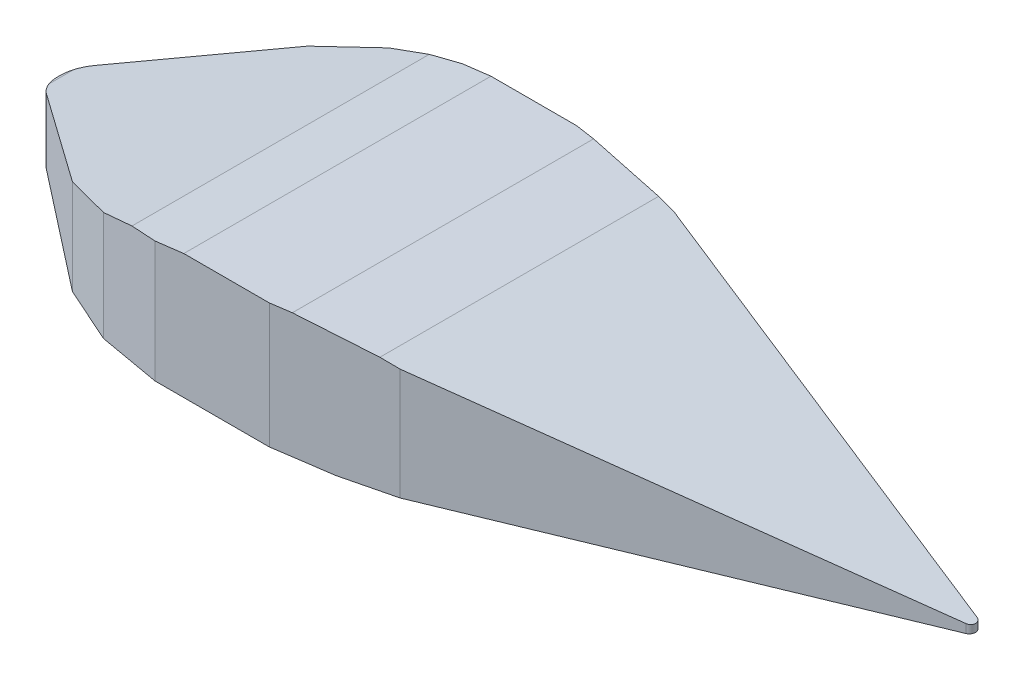
ISO-10303-21;
HEADER;
FILE_DESCRIPTION(('STEP AP214'),'2;1');
FILE_NAME('part.step','',(''),(''),'','','');
FILE_SCHEMA(('AUTOMOTIVE_DESIGN { 1 0 10303 214 1 1 1 1 }'));
ENDSEC;
DATA;
#1=APPLICATION_CONTEXT('core data for automotive mechanical design processes');
#2=APPLICATION_PROTOCOL_DEFINITION('international standard','automotive_design',2000,#1);
#3=PRODUCT_CONTEXT('',#1,'mechanical');
#4=PRODUCT('Part','Part','',(#3));
#5=PRODUCT_RELATED_PRODUCT_CATEGORY('part','',(#4));
#6=PRODUCT_DEFINITION_FORMATION('','',#4);
#7=PRODUCT_DEFINITION_CONTEXT('part definition',#1,'design');
#8=PRODUCT_DEFINITION('design','',#6,#7);
#9=PRODUCT_DEFINITION_SHAPE('','',#8);
#10=(LENGTH_UNIT() NAMED_UNIT(*) SI_UNIT(.MILLI.,.METRE.));
#11=(NAMED_UNIT(*) PLANE_ANGLE_UNIT() SI_UNIT($,.RADIAN.));
#12=(NAMED_UNIT(*) SI_UNIT($,.STERADIAN.) SOLID_ANGLE_UNIT());
#13=UNCERTAINTY_MEASURE_WITH_UNIT(LENGTH_MEASURE(1.E-05),#10,'distance_accuracy_value','');
#14=(GEOMETRIC_REPRESENTATION_CONTEXT(3) GLOBAL_UNCERTAINTY_ASSIGNED_CONTEXT((#13)) GLOBAL_UNIT_ASSIGNED_CONTEXT((#10,
#11,#12)) REPRESENTATION_CONTEXT('',''));
#15=CARTESIAN_POINT('',(0.,0.,0.));
#16=DIRECTION('',(0.,0.,1.));
#17=DIRECTION('',(1.,0.,0.));
#18=AXIS2_PLACEMENT_3D('',#15,#16,#17);
#19=CARTESIAN_POINT('',(1401.451,800.,-800.));
#20=DIRECTION('',(0.,0.,1.));
#21=DIRECTION('',(1.,0.,0.));
#22=AXIS2_PLACEMENT_3D('',#19,#20,#21);
#23=PLANE('',#22);
#24=DIRECTION('',(-0.992522376322293,-0.122062821938327,0.));
#25=VECTOR('',#24,1.);
#26=CARTESIAN_POINT('',(1255.921,763.655,-800.));
#27=LINE('',#26,#25);
#28=CARTESIAN_POINT('',(1551.451,800.,-800.));
#29=VERTEX_POINT('',#28);
#30=CARTESIAN_POINT('',(1401.451,781.55263425033,-800.));
#31=VERTEX_POINT('',#30);
#32=EDGE_CURVE('E469',#29,#31,#27,.T.);
#33=ORIENTED_EDGE('',*,*,#32,.F.);
#34=DIRECTION('',(-1.,0.,0.));
#35=VECTOR('',#34,1.);
#36=CARTESIAN_POINT('',(1401.451,800.,-800.));
#37=LINE('',#36,#35);
#38=CARTESIAN_POINT('',(1997.019,800.,-800.));
#39=VERTEX_POINT('',#38);
#40=EDGE_CURVE('E216',#39,#29,#37,.T.);
#41=ORIENTED_EDGE('',*,*,#40,.F.);
#42=DIRECTION('',(0.,-1.,0.));
#43=VECTOR('',#42,1.);
#44=CARTESIAN_POINT('',(1997.019,800.,-800.));
#45=LINE('',#44,#43);
#46=CARTESIAN_POINT('',(1997.019,150.,-800.));
#47=VERTEX_POINT('',#46);
#48=EDGE_CURVE('E247',#39,#47,#45,.T.);
#49=ORIENTED_EDGE('',*,*,#48,.T.);
#50=DIRECTION('',(1.,0.,0.));
#51=VECTOR('',#50,1.);
#52=CARTESIAN_POINT('',(2301.451,150.,-800.));
#53=LINE('',#52,#51);
#54=CARTESIAN_POINT('',(1401.45099999999,150.,-800.));
#55=VERTEX_POINT('',#54);
#56=EDGE_CURVE('E468',#55,#47,#53,.T.);
#57=ORIENTED_EDGE('',*,*,#56,.F.);
#58=DIRECTION('',(0.,-1.,0.));
#59=VECTOR('',#58,1.);
#60=CARTESIAN_POINT('',(1401.451,800.,-800.));
#61=LINE('',#60,#59);
#62=EDGE_CURVE('E249',#31,#55,#61,.T.);
#63=ORIENTED_EDGE('',*,*,#62,.F.);
#64=EDGE_LOOP('',(#33,#41,#49,#57,#63));
#65=FACE_BOUND('',#64,.T.);
#66=ADVANCED_FACE('F46',(#65),#23,.F.);
#67=CARTESIAN_POINT('',(784.13,800.,-612.54));
#68=DIRECTION('',(0.406737992749078,0.,0.913544856728147));
#69=DIRECTION('',(0.913544856728147,0.,-0.406737992749078));
#70=AXIS2_PLACEMENT_3D('',#67,#68,#69);
#71=PLANE('',#70);
#72=DIRECTION('',(0.913544856728147,0.,-0.406737992749078));
#73=VECTOR('',#72,1.);
#74=CARTESIAN_POINT('',(784.13,150.,-612.54));
#75=LINE('',#74,#73);
#76=CARTESIAN_POINT('',(784.13,150.,-612.54));
#77=VERTEX_POINT('',#76);
#78=CARTESIAN_POINT('',(1076.464,150.,-742.696));
#79=VERTEX_POINT('',#78);
#80=EDGE_CURVE('E409',#77,#79,#75,.T.);
#81=ORIENTED_EDGE('',*,*,#80,.F.);
#82=DIRECTION('',(0.,-1.,0.));
#83=VECTOR('',#82,1.);
#84=CARTESIAN_POINT('',(784.13,800.,-612.54));
#85=LINE('',#84,#83);
#86=CARTESIAN_POINT('',(784.13,645.829431269961,-612.54));
#87=VERTEX_POINT('',#86);
#88=EDGE_CURVE('E292',#87,#77,#85,.T.);
#89=ORIENTED_EDGE('',*,*,#88,.F.);
#90=DIRECTION('',(-0.890658508940707,-0.222433970466134,0.396548293697233));
#91=VECTOR('',#90,1.);
#92=CARTESIAN_POINT('',(814.673148937951,653.457308644519,-626.138740116332));
#93=LINE('',#92,#91);
#94=CARTESIAN_POINT('',(1076.464,718.837224570654,-742.696));
#95=VERTEX_POINT('',#94);
#96=EDGE_CURVE('E494',#95,#87,#93,.T.);
#97=ORIENTED_EDGE('',*,*,#96,.F.);
#98=DIRECTION('',(0.,-1.,0.));
#99=VECTOR('',#98,1.);
#100=CARTESIAN_POINT('',(1076.464,800.,-742.696));
#101=LINE('',#100,#99);
#102=EDGE_CURVE('E244',#95,#79,#101,.T.);
#103=ORIENTED_EDGE('',*,*,#102,.T.);
#104=EDGE_LOOP('',(#81,#89,#97,#103));
#105=FACE_BOUND('',#104,.T.);
#106=ADVANCED_FACE('F48',(#105),#71,.F.);
#107=CARTESIAN_POINT('',(161.409759474516,800.,-126.088702215857));
#108=DIRECTION('',(0.615605620682322,0.,0.788054388849103));
#109=DIRECTION('',(0.788054388849103,0.,-0.615605620682322));
#110=AXIS2_PLACEMENT_3D('',#107,#108,#109);
#111=PLANE('',#110);
#112=DIRECTION('',(0.788054388849103,0.,-0.615605620682322));
#113=VECTOR('',#112,1.);
#114=CARTESIAN_POINT('',(161.409759474516,150.,-126.088702215857));
#115=LINE('',#114,#113);
#116=CARTESIAN_POINT('',(161.409759474516,150.,-126.088702215857));
#117=VERTEX_POINT('',#116);
#118=EDGE_CURVE('E406',#117,#77,#115,.T.);
#119=ORIENTED_EDGE('',*,*,#118,.F.);
#120=DIRECTION('',(0.,-1.,0.));
#121=VECTOR('',#120,1.);
#122=CARTESIAN_POINT('',(161.409759474516,800.,-126.088702215857));
#123=LINE('',#122,#121);
#124=CARTESIAN_POINT('',(161.409759474516,490.310639051325,-126.088702215857));
#125=VERTEX_POINT('',#124);
#126=EDGE_CURVE('E286',#125,#117,#123,.T.);
#127=ORIENTED_EDGE('',*,*,#126,.F.);
#128=DIRECTION('',(-0.773221678679863,-0.193105175903845,0.604018730387262));
#129=VECTOR('',#128,1.);
#130=CARTESIAN_POINT('',(207.650440557195,501.858834220438,-162.210603929074));
#131=LINE('',#130,#129);
#132=EDGE_CURVE('E499',#87,#125,#131,.T.);
#133=ORIENTED_EDGE('',*,*,#132,.F.);
#134=ORIENTED_EDGE('',*,*,#88,.T.);
#135=EDGE_LOOP('',(#119,#127,#133,#134));
#136=FACE_BOUND('',#135,.T.);
#137=ADVANCED_FACE('F380',(#136),#111,.F.);
#138=CARTESIAN_POINT('',(259.906658783687,800.,0.));
#139=DIRECTION('',(0.,-1.,0.));
#140=DIRECTION('',(0.,0.,-1.));
#141=AXIS2_PLACEMENT_3D('',#138,#139,#140);
#142=CYLINDRICAL_SURFACE('',#141,160.);
#143=CARTESIAN_POINT('',(259.906658783687,150.,0.));
#144=DIRECTION('',(0.,-1.,0.));
#145=DIRECTION('',(0.,0.,-1.));
#146=AXIS2_PLACEMENT_3D('',#143,#144,#145);
#147=CIRCLE('',#146,160.);
#148=CARTESIAN_POINT('',(150.000000000001,150.,-116.277798203296));
#149=VERTEX_POINT('',#148);
#150=EDGE_CURVE('E415',#149,#117,#147,.T.);
#151=ORIENTED_EDGE('',*,*,#150,.F.);
#152=CARTESIAN_POINT('',(150.000000000001,150.,116.277798203296));
#153=CARTESIAN_POINT('',(149.197227518989,150.000000444739,115.519013001235));
#154=CARTESIAN_POINT('',(148.402349323818,150.006444551494,114.751945115754));
#155=CARTESIAN_POINT('',(146.828761077163,150.031461689993,113.201629596887));
#156=CARTESIAN_POINT('',(146.050050642099,150.050034433644,112.418382348238));
#157=CARTESIAN_POINT('',(143.738992605804,150.122798834219,110.04521254094));
#158=CARTESIAN_POINT('',(142.231396084721,150.194037269926,108.43155736251));
#159=CARTESIAN_POINT('',(139.286546373213,150.375814699117,105.145862331909));
#160=CARTESIAN_POINT('',(137.849239225862,150.486322991144,103.473869007217));
#161=CARTESIAN_POINT('',(135.046053340974,150.740627964951,100.073395601841));
#162=CARTESIAN_POINT('',(133.680177219111,150.884425864692,98.3449134563995));
#163=CARTESIAN_POINT('',(131.02300306583,151.199252798717,94.8358771461096));
#164=CARTESIAN_POINT('',(129.731654200361,151.37026296545,93.0553597529596));
#165=CARTESIAN_POINT('',(127.224251842487,151.733785604688,89.4439038255724));
#166=CARTESIAN_POINT('',(126.008207640174,151.926300722009,87.6129591103741));
#167=CARTESIAN_POINT('',(123.653075843413,152.327163170553,83.9034496690219));
#168=CARTESIAN_POINT('',(122.514002675644,152.535513454298,82.0248761060327));
#169=CARTESIAN_POINT('',(120.314753352958,152.962451132073,78.2235331504458));
#170=CARTESIAN_POINT('',(119.254568306852,153.181037367909,76.3007687705009));
#171=CARTESIAN_POINT('',(117.216364660646,153.622684269366,72.4173979297616));
#172=CARTESIAN_POINT('',(116.238193444443,153.84573562226,70.4568704991597));
#173=CARTESIAN_POINT('',(114.363161419552,154.291577394139,66.4972847107506));
#174=CARTESIAN_POINT('',(113.466300511938,154.514367813441,64.498226399826));
#175=CARTESIAN_POINT('',(111.755279479412,154.954759642745,60.4646006807219));
#176=CARTESIAN_POINT('',(110.941114441265,155.172361360436,58.4300353905561));
#177=CARTESIAN_POINT('',(109.396721623775,155.597730716471,54.3282724139932));
#178=CARTESIAN_POINT('',(108.666493845212,155.805498354724,52.2610747272925));
#179=CARTESIAN_POINT('',(107.291517437633,156.206751675774,48.0980446572107));
#180=CARTESIAN_POINT('',(106.646732773703,156.400243363975,46.002224759014));
#181=CARTESIAN_POINT('',(105.443470641596,156.769026649784,41.7843631491049));
#182=CARTESIAN_POINT('',(104.884993033116,156.944318276979,39.6623214800256));
#183=CARTESIAN_POINT('',(103.855447732851,157.273084547455,35.3954250788465));
#184=CARTESIAN_POINT('',(103.384381074604,157.426558932767,33.2505700773214));
#185=CARTESIAN_POINT('',(102.530668116976,157.708522147084,28.9416891731521));
#186=CARTESIAN_POINT('',(102.148022100941,157.837010896023,26.7776632090972));
#187=CARTESIAN_POINT('',(101.465667462758,158.068499170636,22.3934355301932));
#188=CARTESIAN_POINT('',(101.16765188495,158.170974528566,20.1729421971747));
#189=CARTESIAN_POINT('',(100.665032437988,158.345025688777,15.7201891996206));
#190=CARTESIAN_POINT('',(100.460428869546,158.416601391587,13.4879294972302));
#191=CARTESIAN_POINT('',(100.145158117363,158.527307591483,9.01595322708889));
#192=CARTESIAN_POINT('',(100.034491923749,158.566437746585,6.77623658098936));
#193=CARTESIAN_POINT('',(99.9073913706491,158.611403854638,2.29379848782876));
#194=CARTESIAN_POINT('',(99.8909568527162,158.617239863573,0.051077045826518));
#195=CARTESIAN_POINT('',(99.9523649444746,158.595490600866,-4.43306367901725));
#196=CARTESIAN_POINT('',(100.030213962676,158.567903057404,-6.67448286298269));
#197=CARTESIAN_POINT('',(100.279994263522,158.479900598214,-11.1514286514722));
#198=CARTESIAN_POINT('',(100.451925825091,158.419485585162,-13.3869552385069));
#199=CARTESIAN_POINT('',(100.889419452544,158.267136953808,-17.8476868417839));
#200=CARTESIAN_POINT('',(101.154979400206,158.175204048558,-20.0728920903795));
#201=CARTESIAN_POINT('',(101.779063595891,157.961800844771,-24.5087784389172));
#202=CARTESIAN_POINT('',(102.137587017684,157.840330808752,-26.7194596677651));
#203=CARTESIAN_POINT('',(102.926775780276,157.577123600622,-31.013612685877));
#204=CARTESIAN_POINT('',(103.353010132429,157.436681731273,-33.0979803235239));
#205=CARTESIAN_POINT('',(104.287844992139,157.134188084224,-37.2465553021804));
#206=CARTESIAN_POINT('',(104.796444743854,156.972136504832,-39.3107628280092));
#207=CARTESIAN_POINT('',(105.895018848793,156.629565097021,-43.4157709760834));
#208=CARTESIAN_POINT('',(106.484990458811,156.449045891235,-45.456572384884));
#209=CARTESIAN_POINT('',(107.745269602171,156.073038938233,-49.5118169088476));
#210=CARTESIAN_POINT('',(108.415577358716,155.87755114943,-51.5262599507603));
#211=CARTESIAN_POINT('',(109.835448832084,155.475423435206,-55.5259909350782));
#212=CARTESIAN_POINT('',(110.585016389714,155.268782969582,-57.5112774592898));
#213=CARTESIAN_POINT('',(112.162222998921,154.848463183412,-61.449830452093));
#214=CARTESIAN_POINT('',(112.989862077778,154.634783860406,-63.4030969094954));
#215=CARTESIAN_POINT('',(114.722056314859,154.204722154663,-67.2750290342799));
#216=CARTESIAN_POINT('',(115.626615162842,153.988339642681,-69.1936930364624));
#217=CARTESIAN_POINT('',(117.511377819577,153.557438268491,-72.9937124329083));
#218=CARTESIAN_POINT('',(118.491581457163,153.342919402067,-74.8750679115794));
#219=CARTESIAN_POINT('',(120.50777368734,152.924342060301,-78.5639102097275));
#220=CARTESIAN_POINT('',(121.542417530248,152.72016412512,-80.3721185349167));
#221=CARTESIAN_POINT('',(123.6821993027,152.32279256364,-83.9478298250324));
#222=CARTESIAN_POINT('',(124.787344283253,152.129600039688,-85.71532869436));
#223=CARTESIAN_POINT('',(127.066448812287,151.759031112758,-89.2066346063972));
#224=CARTESIAN_POINT('',(128.240395586125,151.581651789015,-90.9304496754102));
#225=CARTESIAN_POINT('',(130.655656175891,151.247580067016,-94.3320138856592));
#226=CARTESIAN_POINT('',(131.896962496125,151.090885373631,-96.0097681213313));
#227=CARTESIAN_POINT('',(134.446592080054,150.803019950715,-99.3183641400929));
#228=CARTESIAN_POINT('',(135.754977031147,150.671873267667,-100.949160506855));
#229=CARTESIAN_POINT('',(138.435759352656,150.44038541193,-104.159463428637));
#230=CARTESIAN_POINT('',(139.808154676331,150.340043255038,-105.73897162087));
#231=CARTESIAN_POINT('',(142.615869629207,150.1752575045,-108.845099188879));
#232=CARTESIAN_POINT('',(144.051233647807,150.110839688822,-110.371679851087));
#233=CARTESIAN_POINT('',(146.981580403563,150.023207631752,-113.368082399426));
#234=CARTESIAN_POINT('',(148.476570551278,149.999998528351,-114.83789718552));
#235=CARTESIAN_POINT('',(150.000000000001,150.,-116.277798203296));
#236=B_SPLINE_CURVE_WITH_KNOTS('',3,(#152,#153,#154,#155,#156,#157,#158,#159,#160,#161,#162,
#163,#164,#165,#166,#167,#168,#169,#170,#171,#172,#173,#174,#175,#176,#177,#178,#179,#180,#181,
#182,#183,#184,#185,#186,#187,#188,#189,#190,#191,#192,#193,#194,#195,#196,#197,#198,#199,#200,
#201,#202,#203,#204,#205,#206,#207,#208,#209,#210,#211,#212,#213,#214,#215,#216,#217,#218,#219,
#220,#221,#222,#223,#224,#225,#226,#227,#228,#229,#230,#231,#232,#233,#234,#235),.UNSPECIFIED.,
.F.,.F.,(4,2,2,2,2,2,2,2,2,2,2,2,2,2,2,2,2,2,2,2,2,2,2,2,2,2,2,2,2,2,2,2,2,2,2,2,2,2,2,2,2,4),
(0.,3.31371001652173,6.6273413252177,13.2532751900696,19.8740402078592,26.4950474965281,
33.1114839710404,39.728735074476,46.347223028574,52.9649639039096,59.5701033647876,
66.1752347893619,72.7799735513202,79.3847123747203,85.9866567792445,92.588590451293,
99.190602178882,105.792635062469,112.518689760156,119.244766110194,125.970913354142,
132.697049288266,139.42364242767,146.150255509359,152.876716419738,159.603117549501,
165.997719115792,172.392262004003,178.786589372256,185.180934506686,191.575589643311,
197.970247014478,204.3652113037,210.76016112315,217.038388778441,223.317245323713,
229.59493972496,235.871936978217,242.154814065332,248.437490393973,254.724669155171,
261.012631760362),.UNSPECIFIED.);
#237=CARTESIAN_POINT('',(150.000000000001,150.,116.277798203296));
#238=VERTEX_POINT('',#237);
#239=EDGE_CURVE('E12',#238,#149,#236,.T.);
#240=ORIENTED_EDGE('',*,*,#239,.F.);
#241=CARTESIAN_POINT('',(161.409759474516,150.,126.088702215857));
#242=VERTEX_POINT('',#241);
#243=EDGE_CURVE('E390',#242,#238,#147,.T.);
#244=ORIENTED_EDGE('',*,*,#243,.F.);
#245=DIRECTION('',(0.,-1.,0.));
#246=VECTOR('',#245,1.);
#247=CARTESIAN_POINT('',(161.409759474516,800.,126.088702215857));
#248=LINE('',#247,#246);
#249=CARTESIAN_POINT('',(161.409759474516,490.310639051325,126.088702215857));
#250=VERTEX_POINT('',#249);
#251=EDGE_CURVE('E282',#250,#242,#248,.T.);
#252=ORIENTED_EDGE('',*,*,#251,.F.);
#253=CARTESIAN_POINT('',(259.906658783687,514.909355812027,0.));
#254=DIRECTION('',(-0.242299141310606,0.970201590454346,0.));
#255=DIRECTION('',(-0.970201590454346,-0.242299141310606,0.));
#256=AXIS2_PLACEMENT_3D('',#253,#254,#255);
#257=ELLIPSE('',#256,164.914180283988,160.);
#258=CARTESIAN_POINT('',(113.655128803409,478.384348557619,64.8882884535251));
#259=VERTEX_POINT('',#258);
#260=EDGE_CURVE('E402',#259,#250,#257,.T.);
#261=ORIENTED_EDGE('',*,*,#260,.F.);
#262=CARTESIAN_POINT('',(113.655128803409,478.384348557619,-64.8882884535262));
#263=CARTESIAN_POINT('',(112.773939032918,478.164232994411,-62.9022135519064));
#264=CARTESIAN_POINT('',(111.933155729284,477.945795953747,-60.8980057661391));
#265=CARTESIAN_POINT('',(110.333625202496,477.516710712539,-56.8562236105315));
#266=CARTESIAN_POINT('',(109.574880662755,477.306062766917,-54.8186481517732));
#267=CARTESIAN_POINT('',(108.140474526136,476.896935722458,-50.7124900371555));
#268=CARTESIAN_POINT('',(107.464840130629,476.698460618308,-48.6438974768202));
#269=CARTESIAN_POINT('',(106.198137658814,476.317814583301,-44.4795123289952));
#270=CARTESIAN_POINT('',(105.607068680471,476.135643478542,-42.3837200318979));
#271=CARTESIAN_POINT('',(104.511164120193,475.791492586405,-38.170326894472));
#272=CARTESIAN_POINT('',(104.006242210099,475.629492630005,-36.0527501682851));
#273=CARTESIAN_POINT('',(103.082932209994,475.328755377082,-31.7971598743901));
#274=CARTESIAN_POINT('',(102.66454431668,475.190018133439,-29.6591462602389));
#275=CARTESIAN_POINT('',(101.915268820844,474.938644041753,-25.3666448290491));
#276=CARTESIAN_POINT('',(101.58436782491,474.826003198927,-23.2121595856825));
#277=CARTESIAN_POINT('',(101.010740244002,474.629088177567,-18.8901866979925));
#278=CARTESIAN_POINT('',(100.768013552683,474.544813964819,-16.7226990693543));
#279=CARTESIAN_POINT('',(100.37076423608,474.406161867699,-12.3726224328995));
#280=CARTESIAN_POINT('',(100.21648827366,474.351867603903,-10.1900082088244));
#281=CARTESIAN_POINT('',(99.9975671230744,474.274653761924,-5.8197269539753));
#282=CARTESIAN_POINT('',(99.9329221235671,474.251734249778,-3.63205991257581));
#283=CARTESIAN_POINT('',(99.8934242819723,474.237742403755,0.744450738233989));
#284=CARTESIAN_POINT('',(99.9185822486836,474.246673903504,2.93329445756778));
#285=CARTESIAN_POINT('',(100.05865020922,474.296207977458,7.30773390133306));
#286=CARTESIAN_POINT('',(100.173559683034,474.336810368165,9.49332964450948));
#287=CARTESIAN_POINT('',(100.492693380218,474.448796061191,13.8551440212281));
#288=CARTESIAN_POINT('',(100.696834271621,474.520150643601,16.0313694952312));
#289=CARTESIAN_POINT('',(101.193919943739,474.692171407193,20.3725274347643));
#290=CARTESIAN_POINT('',(101.486866629951,474.792838217324,22.5374596569623));
#291=CARTESIAN_POINT('',(102.16078590948,475.021392150112,26.8515295793954));
#292=CARTESIAN_POINT('',(102.541734866669,475.149271963028,29.0006713610749));
#293=CARTESIAN_POINT('',(103.390811659426,475.429645345374,33.2798357862657));
#294=CARTESIAN_POINT('',(103.8589325439,475.582136952128,35.4098599400322));
#295=CARTESIAN_POINT('',(104.936939869616,475.926381416005,39.8776210107061));
#296=CARTESIAN_POINT('',(105.556701493798,476.120599632764,42.2127912998076));
#297=CARTESIAN_POINT('',(106.900536974426,476.5305848942,46.8503359801782));
#298=CARTESIAN_POINT('',(107.624586121608,476.746346830732,49.1527179985066));
#299=CARTESIAN_POINT('',(109.174416422244,477.193713901137,53.7177097487012));
#300=CARTESIAN_POINT('',(110.000046911566,477.425295350108,55.980372828677));
#301=CARTESIAN_POINT('',(111.314153213711,477.78033591011,59.3440574899914));
#302=CARTESIAN_POINT('',(111.764862264654,477.899976882307,60.4603772225235));
#303=CARTESIAN_POINT('',(112.691287391965,478.141029180627,62.6823991134768));
#304=CARTESIAN_POINT('',(113.167003475439,478.262440507252,63.7881012688804));
#305=CARTESIAN_POINT('',(113.655128803409,478.384348557619,64.8882884535262));
#306=B_SPLINE_CURVE_WITH_KNOTS('',3,(#262,#263,#264,#265,#266,#267,#268,#269,#270,#271,#272,
#273,#274,#275,#276,#277,#278,#279,#280,#281,#282,#283,#284,#285,#286,#287,#288,#289,#290,#291,
#292,#293,#294,#295,#296,#297,#298,#299,#300,#301,#302,#303,#304,#305),.UNSPECIFIED.,.F.,.F.,(4,
2,2,2,2,2,2,2,2,2,2,2,2,2,2,2,2,2,2,2,2,4),(0.,6.55129299468969,13.1028002115111,
19.6564460177392,26.2100219127685,32.7569913826109,39.3039757340479,45.849957223369,
52.395930817664,58.9600714939325,65.5242259865693,72.0891705757979,78.654077128723,
85.2128658627704,91.7717953380147,98.3289652243588,104.885612465355,112.154383970393,
119.421436080517,126.677836867381,130.306981102657,133.936126369311),.UNSPECIFIED.);
#307=CARTESIAN_POINT('',(113.655128803409,478.384348557619,-64.8882884535256));
#308=VERTEX_POINT('',#307);
#309=EDGE_CURVE('E63',#308,#259,#306,.T.);
#310=ORIENTED_EDGE('',*,*,#309,.F.);
#311=EDGE_CURVE('E401',#125,#308,#257,.T.);
#312=ORIENTED_EDGE('',*,*,#311,.F.);
#313=ORIENTED_EDGE('',*,*,#126,.T.);
#314=EDGE_LOOP('',(#151,#240,#244,#252,#261,#310,#312,#313));
#315=FACE_BOUND('',#314,.T.);
#316=ADVANCED_FACE('F316',(#315),#142,.T.);
#317=CARTESIAN_POINT('',(784.13,800.,612.54));
#318=DIRECTION('',(0.615605620682322,0.,-0.788054388849103));
#319=DIRECTION('',(-0.788054388849103,0.,-0.615605620682322));
#320=AXIS2_PLACEMENT_3D('',#317,#318,#319);
#321=PLANE('',#320);
#322=DIRECTION('',(-0.788054388849103,0.,-0.615605620682322));
#323=VECTOR('',#322,1.);
#324=CARTESIAN_POINT('',(784.13,150.,612.54));
#325=LINE('',#324,#323);
#326=CARTESIAN_POINT('',(784.13,150.,612.54));
#327=VERTEX_POINT('',#326);
#328=EDGE_CURVE('E381',#327,#242,#325,.T.);
#329=ORIENTED_EDGE('',*,*,#328,.F.);
#330=DIRECTION('',(0.,-1.,0.));
#331=VECTOR('',#330,1.);
#332=CARTESIAN_POINT('',(784.13,800.,612.54));
#333=LINE('',#332,#331);
#334=CARTESIAN_POINT('',(784.13,645.82943126996,612.54));
#335=VERTEX_POINT('',#334);
#336=EDGE_CURVE('E276',#335,#327,#333,.T.);
#337=ORIENTED_EDGE('',*,*,#336,.F.);
#338=DIRECTION('',(0.773221678679863,0.193105175903845,0.604018730387262));
#339=VECTOR('',#338,1.);
#340=CARTESIAN_POINT('',(807.149686821474,651.578391491176,630.522323040345));
#341=LINE('',#340,#339);
#342=EDGE_CURVE('E399',#250,#335,#341,.T.);
#343=ORIENTED_EDGE('',*,*,#342,.F.);
#344=ORIENTED_EDGE('',*,*,#251,.T.);
#345=EDGE_LOOP('',(#329,#337,#343,#344));
#346=FACE_BOUND('',#345,.T.);
#347=ADVANCED_FACE('F367',(#346),#321,.F.);
#348=CARTESIAN_POINT('',(1076.464,800.,742.696));
#349=DIRECTION('',(0.406737992749078,0.,-0.913544856728147));
#350=DIRECTION('',(-0.913544856728147,0.,-0.406737992749078));
#351=AXIS2_PLACEMENT_3D('',#348,#349,#350);
#352=PLANE('',#351);
#353=DIRECTION('',(-0.913544856728147,0.,-0.406737992749078));
#354=VECTOR('',#353,1.);
#355=CARTESIAN_POINT('',(1076.464,150.,742.696));
#356=LINE('',#355,#354);
#357=CARTESIAN_POINT('',(1076.464,150.,742.696));
#358=VERTEX_POINT('',#357);
#359=EDGE_CURVE('E389',#358,#327,#356,.T.);
#360=ORIENTED_EDGE('',*,*,#359,.F.);
#361=DIRECTION('',(0.,-1.,0.));
#362=VECTOR('',#361,1.);
#363=CARTESIAN_POINT('',(1076.464,800.,742.696));
#364=LINE('',#363,#362);
#365=CARTESIAN_POINT('',(1076.464,718.837224570654,742.696));
#366=VERTEX_POINT('',#365);
#367=EDGE_CURVE('E274',#366,#358,#364,.T.);
#368=ORIENTED_EDGE('',*,*,#367,.F.);
#369=DIRECTION('',(0.890658508940707,0.222433970466134,0.396548293697233));
#370=VECTOR('',#369,1.);
#371=CARTESIAN_POINT('',(1092.5433772675,722.852904758212,749.85502846617));
#372=LINE('',#371,#370);
#373=EDGE_CURVE('E392',#335,#366,#372,.T.);
#374=ORIENTED_EDGE('',*,*,#373,.F.);
#375=ORIENTED_EDGE('',*,*,#336,.T.);
#376=EDGE_LOOP('',(#360,#368,#374,#375));
#377=FACE_BOUND('',#376,.T.);
#378=ADVANCED_FACE('F370',(#377),#352,.F.);
#379=CARTESIAN_POINT('',(1401.451,800.,800.));
#380=DIRECTION('',(0.173648246791891,0.,-0.98480774082361));
#381=DIRECTION('',(-0.98480774082361,0.,-0.173648246791891));
#382=AXIS2_PLACEMENT_3D('',#379,#380,#381);
#383=PLANE('',#382);
#384=DIRECTION('',(-0.98480774082361,0.,-0.173648246791891));
#385=VECTOR('',#384,1.);
#386=CARTESIAN_POINT('',(1401.451,150.,800.));
#387=LINE('',#386,#385);
#388=CARTESIAN_POINT('',(1401.451,150.,800.));
#389=VERTEX_POINT('',#388);
#390=EDGE_CURVE('E425',#389,#358,#387,.T.);
#391=ORIENTED_EDGE('',*,*,#390,.F.);
#392=DIRECTION('',(0.,-1.,0.));
#393=VECTOR('',#392,1.);
#394=CARTESIAN_POINT('',(1401.451,800.,800.));
#395=LINE('',#394,#393);
#396=CARTESIAN_POINT('',(1401.451,781.55263425033,800.));
#397=VERTEX_POINT('',#396);
#398=EDGE_CURVE('E275',#397,#389,#395,.T.);
#399=ORIENTED_EDGE('',*,*,#398,.F.);
#400=DIRECTION('',(0.977663361324776,0.120235424042734,0.172388499408761));
#401=VECTOR('',#400,1.);
#402=CARTESIAN_POINT('',(1403.61948357921,781.819319648382,800.382362319179));
#403=LINE('',#402,#401);
#404=CARTESIAN_POINT('',(1255.921,763.655,774.339123964959));
#405=VERTEX_POINT('',#404);
#406=EDGE_CURVE('E199',#405,#397,#403,.T.);
#407=ORIENTED_EDGE('',*,*,#406,.F.);
#408=DIRECTION('',(0.956308883695465,0.238829562460936,0.168623127298276));
#409=VECTOR('',#408,1.);
#410=CARTESIAN_POINT('',(1401.45104302586,799.999822361657,800.000007586622));
#411=LINE('',#410,#409);
#412=EDGE_CURVE('E396',#366,#405,#411,.T.);
#413=ORIENTED_EDGE('',*,*,#412,.F.);
#414=ORIENTED_EDGE('',*,*,#367,.T.);
#415=EDGE_LOOP('',(#391,#399,#407,#413,#414));
#416=FACE_BOUND('',#415,.T.);
#417=ADVANCED_FACE('F363',(#416),#383,.F.);
#418=CARTESIAN_POINT('',(2590.582,800.,712.35));
#419=DIRECTION('',(-0.146083423120088,0.,-0.989272274699699));
#420=DIRECTION('',(-0.989272274699699,0.,0.146083423120088));
#421=AXIS2_PLACEMENT_3D('',#418,#419,#420);
#422=PLANE('',#421);
#423=DIRECTION('',(0.986303954422834,-0.0774081053297486,-0.145645098507086));
#424=VECTOR('',#423,1.);
#425=CARTESIAN_POINT('',(2587.65111982317,761.841550043635,712.782795924778));
#426=LINE('',#425,#424);
#427=CARTESIAN_POINT('',(2101.451,800.,784.57878135935));
#428=VERTEX_POINT('',#427);
#429=CARTESIAN_POINT('',(2499.002,768.799,725.873395157717));
#430=VERTEX_POINT('',#429);
#431=EDGE_CURVE('E495',#428,#430,#426,.T.);
#432=ORIENTED_EDGE('',*,*,#431,.F.);
#433=DIRECTION('',(0.989272274699699,0.,-0.146083423120088));
#434=VECTOR('',#433,1.);
#435=CARTESIAN_POINT('',(2590.582,800.,712.35));
#436=LINE('',#435,#434);
#437=CARTESIAN_POINT('',(1997.019,800.,800.));
#438=VERTEX_POINT('',#437);
#439=EDGE_CURVE('E229',#438,#428,#436,.T.);
#440=ORIENTED_EDGE('',*,*,#439,.F.);
#441=DIRECTION('',(0.,-1.,0.));
#442=VECTOR('',#441,1.);
#443=CARTESIAN_POINT('',(1997.019,800.,800.));
#444=LINE('',#443,#442);
#445=CARTESIAN_POINT('',(1997.019,150.,800.));
#446=VERTEX_POINT('',#445);
#447=EDGE_CURVE('E221',#438,#446,#444,.T.);
#448=ORIENTED_EDGE('',*,*,#447,.T.);
#449=DIRECTION('',(-0.989272274699699,0.,0.146083423120088));
#450=VECTOR('',#449,1.);
#451=CARTESIAN_POINT('',(2590.582,150.,712.35));
#452=LINE('',#451,#450);
#453=CARTESIAN_POINT('',(2301.451,150.,755.045269331141));
#454=VERTEX_POINT('',#453);
#455=EDGE_CURVE('E420',#454,#446,#452,.T.);
#456=ORIENTED_EDGE('',*,*,#455,.F.);
#457=DIRECTION('',(-0.986267111776523,-0.0778862904046533,0.145639658043396));
#458=VECTOR('',#457,1.);
#459=CARTESIAN_POINT('',(2638.75889840959,176.637470333965,705.235834956693));
#460=LINE('',#459,#458);
#461=CARTESIAN_POINT('',(2590.582,172.832902732024,712.35));
#462=VERTEX_POINT('',#461);
#463=EDGE_CURVE('E437',#462,#454,#460,.T.);
#464=ORIENTED_EDGE('',*,*,#463,.F.);
#465=DIRECTION('',(0.,-1.,0.));
#466=VECTOR('',#465,1.);
#467=CARTESIAN_POINT('',(2590.582,800.,712.35));
#468=LINE('',#467,#466);
#469=CARTESIAN_POINT('',(2590.582,754.334728662365,712.35));
#470=VERTEX_POINT('',#469);
#471=EDGE_CURVE('E266',#470,#462,#468,.T.);
#472=ORIENTED_EDGE('',*,*,#471,.F.);
#473=DIRECTION('',(0.977413355476638,-0.15437401160343,-0.144332245452509));
#474=VECTOR('',#473,1.);
#475=CARTESIAN_POINT('',(2583.69169412628,755.422993062418,713.367474656998));
#476=LINE('',#475,#474);
#477=EDGE_CURVE('E227',#430,#470,#476,.T.);
#478=ORIENTED_EDGE('',*,*,#477,.F.);
#479=EDGE_LOOP('',(#432,#440,#448,#456,#464,#472,#478));
#480=FACE_BOUND('',#479,.T.);
#481=ADVANCED_FACE('F356',(#480),#422,.F.);
#482=CARTESIAN_POINT('',(4854.87610310538,800.,28.719585911815));
#483=DIRECTION('',(-0.289031688101065,0.,-0.957319530393822));
#484=DIRECTION('',(-0.957319530393822,0.,0.289031688101065));
#485=AXIS2_PLACEMENT_3D('',#482,#483,#484);
#486=PLANE('',#485);
#487=DIRECTION('',(0.946560750343431,-0.149501108653882,-0.285783422228339));
#488=VECTOR('',#487,1.);
#489=CARTESIAN_POINT('',(4797.80563476939,405.722787669301,45.9501690976439));
#490=LINE('',#489,#488);
#491=CARTESIAN_POINT('',(4854.87610310538,396.708999294354,28.719585911815));
#492=VERTEX_POINT('',#491);
#493=EDGE_CURVE('E233',#470,#492,#490,.T.);
#494=ORIENTED_EDGE('',*,*,#493,.F.);
#495=ORIENTED_EDGE('',*,*,#471,.T.);
#496=DIRECTION('',(-0.954595468747509,-0.0753851558163702,0.28820924573869));
#497=VECTOR('',#496,1.);
#498=CARTESIAN_POINT('',(4887.14070143258,354.193951696659,18.9783333578474));
#499=LINE('',#498,#497);
#500=CARTESIAN_POINT('',(4854.87610310538,351.645990961585,28.719585911815));
#501=VERTEX_POINT('',#500);
#502=EDGE_CURVE('E434',#501,#462,#499,.T.);
#503=ORIENTED_EDGE('',*,*,#502,.F.);
#504=DIRECTION('',(0.,-1.,0.));
#505=VECTOR('',#504,1.);
#506=CARTESIAN_POINT('',(4854.87610310538,800.,28.719585911815));
#507=LINE('',#506,#505);
#508=EDGE_CURVE('E265',#492,#501,#507,.T.);
#509=ORIENTED_EDGE('',*,*,#508,.F.);
#510=EDGE_LOOP('',(#494,#495,#503,#509));
#511=FACE_BOUND('',#510,.T.);
#512=ADVANCED_FACE('F352',(#511),#486,.F.);
#513=CARTESIAN_POINT('',(4846.20515246235,800.,0.));
#514=DIRECTION('',(0.,-1.,0.));
#515=DIRECTION('',(0.,0.,-1.));
#516=AXIS2_PLACEMENT_3D('',#513,#514,#515);
#517=CYLINDRICAL_SURFACE('',#516,30.0000000000002);
#518=CARTESIAN_POINT('',(4846.20515246235,398.078501181841,0.));
#519=DIRECTION('',(0.156007522138138,0.987755867123207,0.));
#520=DIRECTION('',(0.987755867123207,-0.156007522138138,0.));
#521=AXIS2_PLACEMENT_3D('',#518,#519,#520);
#522=ELLIPSE('',#521,30.3718773013961,30.0000000000002);
#523=CARTESIAN_POINT('',(4854.87610310538,396.708999294354,-28.7195859118152));
#524=VERTEX_POINT('',#523);
#525=EDGE_CURVE('E444',#492,#524,#522,.T.);
#526=ORIENTED_EDGE('',*,*,#525,.F.);
#527=ORIENTED_EDGE('',*,*,#508,.T.);
#528=CARTESIAN_POINT('',(4846.20515246235,350.96123916179,0.));
#529=DIRECTION('',(0.0787256870846496,-0.996896316671423,0.));
#530=DIRECTION('',(-0.996896316671423,-0.0787256870846496,0.));
#531=AXIS2_PLACEMENT_3D('',#528,#529,#530);
#532=ELLIPSE('',#531,30.0934003850755,30.0000000000002);
#533=CARTESIAN_POINT('',(4854.87610310538,351.645990961585,-28.719585911815));
#534=VERTEX_POINT('',#533);
#535=EDGE_CURVE('E435',#534,#501,#532,.T.);
#536=ORIENTED_EDGE('',*,*,#535,.F.);
#537=DIRECTION('',(0.,-1.,0.));
#538=VECTOR('',#537,1.);
#539=CARTESIAN_POINT('',(4854.87610310538,800.,-28.719585911815));
#540=LINE('',#539,#538);
#541=EDGE_CURVE('E256',#524,#534,#540,.T.);
#542=ORIENTED_EDGE('',*,*,#541,.F.);
#543=EDGE_LOOP('',(#526,#527,#536,#542));
#544=FACE_BOUND('',#543,.T.);
#545=ADVANCED_FACE('F349',(#544),#517,.T.);
#546=CARTESIAN_POINT('',(2590.582,800.,-712.35));
#547=DIRECTION('',(-0.289031688101065,0.,0.957319530393822));
#548=DIRECTION('',(0.957319530393822,0.,0.289031688101065));
#549=AXIS2_PLACEMENT_3D('',#546,#547,#548);
#550=PLANE('',#549);
#551=DIRECTION('',(-0.946560750343431,0.149501108653882,-0.285783422228339));
#552=VECTOR('',#551,1.);
#553=CARTESIAN_POINT('',(2584.11982152994,755.355374030602,-714.30104590757));
#554=LINE('',#553,#552);
#555=CARTESIAN_POINT('',(2590.582,754.334728662365,-712.35));
#556=VERTEX_POINT('',#555);
#557=EDGE_CURVE('E70',#524,#556,#554,.T.);
#558=ORIENTED_EDGE('',*,*,#557,.F.);
#559=ORIENTED_EDGE('',*,*,#541,.T.);
#560=DIRECTION('',(0.954595468747509,0.0753851558163702,0.28820924573869));
#561=VECTOR('',#560,1.);
#562=CARTESIAN_POINT('',(2635.71440446045,176.397044249564,-698.723729319096));
#563=LINE('',#562,#561);
#564=CARTESIAN_POINT('',(2590.582,172.832902732024,-712.35));
#565=VERTEX_POINT('',#564);
#566=EDGE_CURVE('E427',#565,#534,#563,.T.);
#567=ORIENTED_EDGE('',*,*,#566,.F.);
#568=DIRECTION('',(0.,-1.,0.));
#569=VECTOR('',#568,1.);
#570=CARTESIAN_POINT('',(2590.582,800.,-712.35));
#571=LINE('',#570,#569);
#572=EDGE_CURVE('E255',#556,#565,#571,.T.);
#573=ORIENTED_EDGE('',*,*,#572,.F.);
#574=EDGE_LOOP('',(#558,#559,#567,#573));
#575=FACE_BOUND('',#574,.T.);
#576=ADVANCED_FACE('F342',(#575),#550,.F.);
#577=CARTESIAN_POINT('',(1997.019,800.,-800.));
#578=DIRECTION('',(-0.146083423120088,0.,0.989272274699699));
#579=DIRECTION('',(0.989272274699699,0.,0.146083423120088));
#580=AXIS2_PLACEMENT_3D('',#577,#578,#579);
#581=PLANE('',#580);
#582=DIRECTION('',(-0.986303954422834,0.0774081053297486,-0.145645098507086));
#583=VECTOR('',#582,1.);
#584=CARTESIAN_POINT('',(1997.64475808654,808.147026554937,-799.907595830122));
#585=LINE('',#584,#583);
#586=CARTESIAN_POINT('',(2499.002,768.799,-725.873395157717));
#587=VERTEX_POINT('',#586);
#588=CARTESIAN_POINT('',(2101.451,800.,-784.57878135935));
#589=VERTEX_POINT('',#588);
#590=EDGE_CURVE('E217',#587,#589,#585,.T.);
#591=ORIENTED_EDGE('',*,*,#590,.F.);
#592=DIRECTION('',(-0.977413355476638,0.15437401160343,-0.144332245452509));
#593=VECTOR('',#592,1.);
#594=CARTESIAN_POINT('',(2004.27409309505,846.937007029627,-798.928658104057));
#595=LINE('',#594,#593);
#596=EDGE_CURVE('E306',#556,#587,#595,.T.);
#597=ORIENTED_EDGE('',*,*,#596,.F.);
#598=ORIENTED_EDGE('',*,*,#572,.T.);
#599=DIRECTION('',(0.986267111776523,0.0778862904046533,0.145639658043396));
#600=VECTOR('',#599,1.);
#601=CARTESIAN_POINT('',(2048.79661434215,130.047684224296,-792.354126020171));
#602=LINE('',#601,#600);
#603=CARTESIAN_POINT('',(2301.451,150.,-755.045269331141));
#604=VERTEX_POINT('',#603);
#605=EDGE_CURVE('E302',#604,#565,#602,.T.);
#606=ORIENTED_EDGE('',*,*,#605,.F.);
#607=DIRECTION('',(0.989272274699699,0.,0.146083423120088));
#608=VECTOR('',#607,1.);
#609=CARTESIAN_POINT('',(1997.019,150.,-800.));
#610=LINE('',#609,#608);
#611=EDGE_CURVE('E418',#47,#604,#610,.T.);
#612=ORIENTED_EDGE('',*,*,#611,.F.);
#613=ORIENTED_EDGE('',*,*,#48,.F.);
#614=DIRECTION('',(-0.989272274699699,0.,-0.146083423120088));
#615=VECTOR('',#614,1.);
#616=CARTESIAN_POINT('',(1997.019,800.,-800.));
#617=LINE('',#616,#615);
#618=EDGE_CURVE('E231',#589,#39,#617,.T.);
#619=ORIENTED_EDGE('',*,*,#618,.F.);
#620=EDGE_LOOP('',(#591,#597,#598,#606,#612,#613,#619));
#621=FACE_BOUND('',#620,.T.);
#622=ADVANCED_FACE('F337',(#621),#581,.F.);
#623=CARTESIAN_POINT('',(1076.464,800.,-742.696));
#624=DIRECTION('',(0.173648246791891,0.,0.98480774082361));
#625=DIRECTION('',(0.98480774082361,0.,-0.173648246791891));
#626=AXIS2_PLACEMENT_3D('',#623,#624,#625);
#627=PLANE('',#626);
#628=DIRECTION('',(0.98480774082361,0.,-0.173648246791891));
#629=VECTOR('',#628,1.);
#630=CARTESIAN_POINT('',(1076.464,150.,-742.696));
#631=LINE('',#630,#629);
#632=EDGE_CURVE('E301',#79,#55,#631,.T.);
#633=ORIENTED_EDGE('',*,*,#632,.F.);
#634=ORIENTED_EDGE('',*,*,#102,.F.);
#635=DIRECTION('',(-0.956308883695465,-0.238829562460936,0.168623127298276));
#636=VECTOR('',#635,1.);
#637=CARTESIAN_POINT('',(1095.00115848079,723.466713561835,-745.964602527435));
#638=LINE('',#637,#636);
#639=CARTESIAN_POINT('',(1255.921,763.655,-774.339123964959));
#640=VERTEX_POINT('',#639);
#641=EDGE_CURVE('E298',#640,#95,#638,.T.);
#642=ORIENTED_EDGE('',*,*,#641,.F.);
#643=DIRECTION('',(-0.977663361324776,-0.120235424042734,0.172388499408761));
#644=VECTOR('',#643,1.);
#645=CARTESIAN_POINT('',(1083.33067673226,742.429421212174,-743.906780872666));
#646=LINE('',#645,#644);
#647=EDGE_CURVE('E300',#31,#640,#646,.T.);
#648=ORIENTED_EDGE('',*,*,#647,.F.);
#649=ORIENTED_EDGE('',*,*,#62,.T.);
#650=EDGE_LOOP('',(#633,#634,#642,#648,#649));
#651=FACE_BOUND('',#650,.T.);
#652=ADVANCED_FACE('F333',(#651),#627,.F.);
#653=CARTESIAN_POINT('',(4846.20515246235,800.,0.));
#654=DIRECTION('',(0.,-1.,0.));
#655=DIRECTION('',(0.,0.,-1.));
#656=AXIS2_PLACEMENT_3D('',#653,#654,#655);
#657=PLANE('',#656);
#658=DIRECTION('',(0.,0.,1.));
#659=VECTOR('',#658,1.);
#660=CARTESIAN_POINT('',(2101.451,800.,-800.));
#661=LINE('',#660,#659);
#662=EDGE_CURVE('E293',#589,#428,#661,.T.);
#663=ORIENTED_EDGE('',*,*,#662,.F.);
#664=ORIENTED_EDGE('',*,*,#618,.T.);
#665=ORIENTED_EDGE('',*,*,#40,.T.);
#666=DIRECTION('',(0.,0.,1.));
#667=VECTOR('',#666,1.);
#668=CARTESIAN_POINT('',(1551.451,800.,-800.));
#669=LINE('',#668,#667);
#670=CARTESIAN_POINT('',(1551.451,800.,800.));
#671=VERTEX_POINT('',#670);
#672=EDGE_CURVE('E197',#29,#671,#669,.T.);
#673=ORIENTED_EDGE('',*,*,#672,.T.);
#674=DIRECTION('',(1.,0.,0.));
#675=VECTOR('',#674,1.);
#676=CARTESIAN_POINT('',(1997.019,800.,800.));
#677=LINE('',#676,#675);
#678=EDGE_CURVE('E213',#671,#438,#677,.T.);
#679=ORIENTED_EDGE('',*,*,#678,.T.);
#680=ORIENTED_EDGE('',*,*,#439,.T.);
#681=EDGE_LOOP('',(#663,#664,#665,#673,#679,#680));
#682=FACE_BOUND('',#681,.T.);
#683=ADVANCED_FACE('F211',(#682),#657,.F.);
#684=CARTESIAN_POINT('',(1997.019,800.,800.));
#685=DIRECTION('',(0.,0.,-1.));
#686=DIRECTION('',(-1.,0.,0.));
#687=AXIS2_PLACEMENT_3D('',#684,#685,#686);
#688=PLANE('',#687);
#689=ORIENTED_EDGE('',*,*,#678,.F.);
#690=DIRECTION('',(-0.992522376322293,-0.122062821938327,0.));
#691=VECTOR('',#690,1.);
#692=CARTESIAN_POINT('',(1255.921,763.655,800.));
#693=LINE('',#692,#691);
#694=EDGE_CURVE('E193',#671,#397,#693,.T.);
#695=ORIENTED_EDGE('',*,*,#694,.T.);
#696=ORIENTED_EDGE('',*,*,#398,.T.);
#697=DIRECTION('',(1.,0.,0.));
#698=VECTOR('',#697,1.);
#699=CARTESIAN_POINT('',(2301.451,150.,800.));
#700=LINE('',#699,#698);
#701=EDGE_CURVE('E206',#389,#446,#700,.T.);
#702=ORIENTED_EDGE('',*,*,#701,.T.);
#703=ORIENTED_EDGE('',*,*,#447,.F.);
#704=EDGE_LOOP('',(#689,#695,#696,#702,#703));
#705=FACE_BOUND('',#704,.T.);
#706=ADVANCED_FACE('F222',(#705),#688,.F.);
#707=CARTESIAN_POINT('',(113.655128803409,478.384348557619,-800.));
#708=DIRECTION('',(-0.242299141310606,0.970201590454346,0.));
#709=DIRECTION('',(-0.970201590454346,-0.242299141310606,0.));
#710=AXIS2_PLACEMENT_3D('',#707,#708,#709);
#711=PLANE('',#710);
#712=ORIENTED_EDGE('',*,*,#260,.T.);
#713=ORIENTED_EDGE('',*,*,#342,.T.);
#714=ORIENTED_EDGE('',*,*,#373,.T.);
#715=ORIENTED_EDGE('',*,*,#412,.T.);
#716=DIRECTION('',(0.,0.,1.));
#717=VECTOR('',#716,1.);
#718=CARTESIAN_POINT('',(1255.921,763.655,-800.));
#719=LINE('',#718,#717);
#720=EDGE_CURVE('E78',#640,#405,#719,.T.);
#721=ORIENTED_EDGE('',*,*,#720,.F.);
#722=ORIENTED_EDGE('',*,*,#641,.T.);
#723=ORIENTED_EDGE('',*,*,#96,.T.);
#724=ORIENTED_EDGE('',*,*,#132,.T.);
#725=ORIENTED_EDGE('',*,*,#311,.T.);
#726=DIRECTION('',(0.,0.,1.));
#727=VECTOR('',#726,1.);
#728=CARTESIAN_POINT('',(113.655128803409,478.384348557619,-800.));
#729=LINE('',#728,#727);
#730=EDGE_CURVE('E482',#308,#259,#729,.T.);
#731=ORIENTED_EDGE('',*,*,#730,.T.);
#732=EDGE_LOOP('',(#712,#713,#714,#715,#721,#722,#723,#724,#725,#731));
#733=FACE_BOUND('',#732,.T.);
#734=ADVANCED_FACE('F327',(#733),#711,.T.);
#735=CARTESIAN_POINT('',(1255.921,763.655,-800.));
#736=DIRECTION('',(-0.122062821938327,0.992522376322293,0.));
#737=DIRECTION('',(-0.992522376322293,-0.122062821938327,0.));
#738=AXIS2_PLACEMENT_3D('',#735,#736,#737);
#739=PLANE('',#738);
#740=ORIENTED_EDGE('',*,*,#406,.T.);
#741=ORIENTED_EDGE('',*,*,#694,.F.);
#742=ORIENTED_EDGE('',*,*,#672,.F.);
#743=ORIENTED_EDGE('',*,*,#32,.T.);
#744=ORIENTED_EDGE('',*,*,#647,.T.);
#745=ORIENTED_EDGE('',*,*,#720,.T.);
#746=EDGE_LOOP('',(#740,#741,#742,#743,#744,#745));
#747=FACE_BOUND('',#746,.T.);
#748=ADVANCED_FACE('F198',(#747),#739,.T.);
#749=CARTESIAN_POINT('',(150.,332.854109989467,-800.));
#750=DIRECTION('',(0.,0.,1.));
#751=DIRECTION('',(1.,0.,0.));
#752=AXIS2_PLACEMENT_3D('',#749,#750,#751);
#753=CYLINDRICAL_SURFACE('',#752,150.);
#754=ORIENTED_EDGE('',*,*,#309,.T.);
#755=ORIENTED_EDGE('',*,*,#730,.F.);
#756=EDGE_LOOP('',(#754,#755));
#757=FACE_BOUND('',#756,.T.);
#758=ADVANCED_FACE('F317',(#757),#753,.T.);
#759=CARTESIAN_POINT('',(2301.451,150.,-800.));
#760=DIRECTION('',(0.,-1.,0.));
#761=DIRECTION('',(0.,0.,-1.));
#762=AXIS2_PLACEMENT_3D('',#759,#760,#761);
#763=PLANE('',#762);
#764=ORIENTED_EDGE('',*,*,#243,.T.);
#765=DIRECTION('',(0.,0.,1.));
#766=VECTOR('',#765,1.);
#767=CARTESIAN_POINT('',(150.000000000001,150.,-800.));
#768=LINE('',#767,#766);
#769=EDGE_CURVE('E477',#149,#238,#768,.T.);
#770=ORIENTED_EDGE('',*,*,#769,.F.);
#771=ORIENTED_EDGE('',*,*,#150,.T.);
#772=ORIENTED_EDGE('',*,*,#118,.T.);
#773=ORIENTED_EDGE('',*,*,#80,.T.);
#774=ORIENTED_EDGE('',*,*,#632,.T.);
#775=ORIENTED_EDGE('',*,*,#56,.T.);
#776=ORIENTED_EDGE('',*,*,#611,.T.);
#777=DIRECTION('',(0.,0.,1.));
#778=VECTOR('',#777,1.);
#779=CARTESIAN_POINT('',(2301.451,150.,-800.));
#780=LINE('',#779,#778);
#781=EDGE_CURVE('E465',#604,#454,#780,.T.);
#782=ORIENTED_EDGE('',*,*,#781,.T.);
#783=ORIENTED_EDGE('',*,*,#455,.T.);
#784=ORIENTED_EDGE('',*,*,#701,.F.);
#785=ORIENTED_EDGE('',*,*,#390,.T.);
#786=ORIENTED_EDGE('',*,*,#359,.T.);
#787=ORIENTED_EDGE('',*,*,#328,.T.);
#788=EDGE_LOOP('',(#764,#770,#771,#772,#773,#774,#775,#776,#782,#783,#784,#785,#786,#787));
#789=FACE_BOUND('',#788,.T.);
#790=ADVANCED_FACE('F323',(#789),#763,.T.);
#791=CARTESIAN_POINT('',(4950.,359.158,-800.));
#792=DIRECTION('',(0.0787256870846496,-0.996896316671423,0.));
#793=DIRECTION('',(0.996896316671423,0.0787256870846496,0.));
#794=AXIS2_PLACEMENT_3D('',#791,#792,#793);
#795=PLANE('',#794);
#796=ORIENTED_EDGE('',*,*,#463,.T.);
#797=ORIENTED_EDGE('',*,*,#781,.F.);
#798=ORIENTED_EDGE('',*,*,#605,.T.);
#799=ORIENTED_EDGE('',*,*,#566,.T.);
#800=ORIENTED_EDGE('',*,*,#535,.T.);
#801=ORIENTED_EDGE('',*,*,#502,.T.);
#802=EDGE_LOOP('',(#796,#797,#798,#799,#800,#801));
#803=FACE_BOUND('',#802,.T.);
#804=ADVANCED_FACE('F456',(#803),#795,.T.);
#805=CARTESIAN_POINT('',(150.,300.,-800.));
#806=DIRECTION('',(0.,0.,1.));
#807=DIRECTION('',(1.,0.,0.));
#808=AXIS2_PLACEMENT_3D('',#805,#806,#807);
#809=CYLINDRICAL_SURFACE('',#808,150.);
#810=ORIENTED_EDGE('',*,*,#239,.T.);
#811=ORIENTED_EDGE('',*,*,#769,.T.);
#812=EDGE_LOOP('',(#810,#811));
#813=FACE_BOUND('',#812,.T.);
#814=ADVANCED_FACE('F324',(#813),#809,.T.);
#815=CARTESIAN_POINT('',(2499.002,768.799,-800.));
#816=DIRECTION('',(0.156007522138138,0.987755867123207,0.));
#817=DIRECTION('',(-0.987755867123207,0.156007522138138,0.));
#818=AXIS2_PLACEMENT_3D('',#815,#816,#817);
#819=PLANE('',#818);
#820=ORIENTED_EDGE('',*,*,#477,.T.);
#821=ORIENTED_EDGE('',*,*,#493,.T.);
#822=ORIENTED_EDGE('',*,*,#525,.T.);
#823=ORIENTED_EDGE('',*,*,#557,.T.);
#824=ORIENTED_EDGE('',*,*,#596,.T.);
#825=DIRECTION('',(0.,0.,1.));
#826=VECTOR('',#825,1.);
#827=CARTESIAN_POINT('',(2499.002,768.799,-800.));
#828=LINE('',#827,#826);
#829=EDGE_CURVE('E218',#587,#430,#828,.T.);
#830=ORIENTED_EDGE('',*,*,#829,.T.);
#831=EDGE_LOOP('',(#820,#821,#822,#823,#824,#830));
#832=FACE_BOUND('',#831,.T.);
#833=ADVANCED_FACE('F447',(#832),#819,.T.);
#834=CARTESIAN_POINT('',(2101.451,800.,-800.));
#835=DIRECTION('',(0.0782424118500126,0.996934363430157,0.));
#836=DIRECTION('',(-0.996934363430157,0.0782424118500126,0.));
#837=AXIS2_PLACEMENT_3D('',#834,#835,#836);
#838=PLANE('',#837);
#839=ORIENTED_EDGE('',*,*,#431,.T.);
#840=ORIENTED_EDGE('',*,*,#829,.F.);
#841=ORIENTED_EDGE('',*,*,#590,.T.);
#842=ORIENTED_EDGE('',*,*,#662,.T.);
#843=EDGE_LOOP('',(#839,#840,#841,#842));
#844=FACE_BOUND('',#843,.T.);
#845=ADVANCED_FACE('F518',(#844),#838,.T.);
#846=CLOSED_SHELL('',(#66,#106,#137,#316,#347,#378,#417,#481,#512,#545,#576,#622,#652,#683,#706,
#734,#748,#758,#790,#804,#814,#833,#845));
#847=MANIFOLD_SOLID_BREP('B2',#846);
#848=ADVANCED_BREP_SHAPE_REPRESENTATION('',(#18,#847),#14);
#849=SHAPE_DEFINITION_REPRESENTATION(#9,#848);
ENDSEC;
END-ISO-10303-21;
